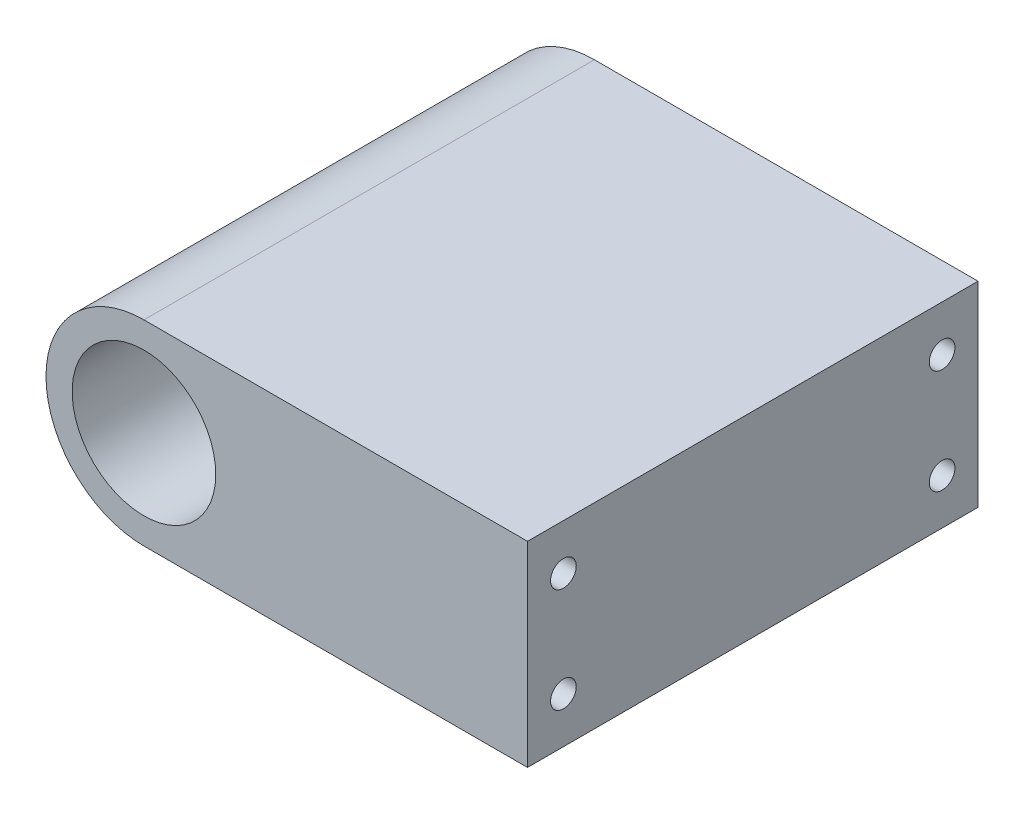
ISO-10303-21;
HEADER;
FILE_DESCRIPTION(('STEP AP214'),'2;1');
FILE_NAME('part.step','',(''),(''),'','','');
FILE_SCHEMA(('AUTOMOTIVE_DESIGN { 1 0 10303 214 1 1 1 1 }'));
ENDSEC;
DATA;
#1=APPLICATION_CONTEXT('core data for automotive mechanical design processes');
#2=APPLICATION_PROTOCOL_DEFINITION('international standard','automotive_design',2000,#1);
#3=PRODUCT_CONTEXT('',#1,'mechanical');
#4=PRODUCT('Part','Part','',(#3));
#5=PRODUCT_RELATED_PRODUCT_CATEGORY('part','',(#4));
#6=PRODUCT_DEFINITION_FORMATION('','',#4);
#7=PRODUCT_DEFINITION_CONTEXT('part definition',#1,'design');
#8=PRODUCT_DEFINITION('design','',#6,#7);
#9=PRODUCT_DEFINITION_SHAPE('','',#8);
#10=(LENGTH_UNIT() NAMED_UNIT(*) SI_UNIT(.MILLI.,.METRE.));
#11=(NAMED_UNIT(*) PLANE_ANGLE_UNIT() SI_UNIT($,.RADIAN.));
#12=(NAMED_UNIT(*) SI_UNIT($,.STERADIAN.) SOLID_ANGLE_UNIT());
#13=UNCERTAINTY_MEASURE_WITH_UNIT(LENGTH_MEASURE(1.E-05),#10,'distance_accuracy_value','');
#14=(GEOMETRIC_REPRESENTATION_CONTEXT(3) GLOBAL_UNCERTAINTY_ASSIGNED_CONTEXT((#13)) GLOBAL_UNIT_ASSIGNED_CONTEXT((#10,
#11,#12)) REPRESENTATION_CONTEXT('',''));
#15=CARTESIAN_POINT('',(0.,0.,0.));
#16=DIRECTION('',(0.,0.,1.));
#17=DIRECTION('',(1.,0.,0.));
#18=AXIS2_PLACEMENT_3D('',#15,#16,#17);
#19=CARTESIAN_POINT('',(0.,0.,87.63));
#20=DIRECTION('',(0.,0.,1.));
#21=DIRECTION('',(1.,0.,0.));
#22=AXIS2_PLACEMENT_3D('',#19,#20,#21);
#23=PLANE('',#22);
#24=CARTESIAN_POINT('',(0.,0.,87.63));
#25=DIRECTION('',(0.,0.,1.));
#26=DIRECTION('',(1.,0.,0.));
#27=AXIS2_PLACEMENT_3D('',#24,#25,#26);
#28=CIRCLE('',#27,19.05);
#29=CARTESIAN_POINT('',(0.,19.05,87.63));
#30=VERTEX_POINT('',#29);
#31=CARTESIAN_POINT('',(0.,-19.05,87.63));
#32=VERTEX_POINT('',#31);
#33=EDGE_CURVE('E138',#30,#32,#28,.T.);
#34=ORIENTED_EDGE('',*,*,#33,.T.);
#35=DIRECTION('',(1.,0.,0.));
#36=VECTOR('',#35,1.);
#37=CARTESIAN_POINT('',(74.609999878,-19.05,87.63));
#38=LINE('',#37,#36);
#39=CARTESIAN_POINT('',(74.609999878,-19.05,87.63));
#40=VERTEX_POINT('',#39);
#41=EDGE_CURVE('E88',#32,#40,#38,.T.);
#42=ORIENTED_EDGE('',*,*,#41,.T.);
#43=DIRECTION('',(0.,1.,0.));
#44=VECTOR('',#43,1.);
#45=CARTESIAN_POINT('',(74.609999878,19.05,87.63));
#46=LINE('',#45,#44);
#47=CARTESIAN_POINT('',(74.609999878,19.05,87.63));
#48=VERTEX_POINT('',#47);
#49=EDGE_CURVE('E141',#40,#48,#46,.T.);
#50=ORIENTED_EDGE('',*,*,#49,.T.);
#51=DIRECTION('',(-1.,0.,0.));
#52=VECTOR('',#51,1.);
#53=CARTESIAN_POINT('',(0.,19.05,87.63));
#54=LINE('',#53,#52);
#55=EDGE_CURVE('E56',#48,#30,#54,.T.);
#56=ORIENTED_EDGE('',*,*,#55,.T.);
#57=EDGE_LOOP('',(#34,#42,#50,#56));
#58=FACE_BOUND('',#57,.T.);
#59=CARTESIAN_POINT('',(0.,0.,87.63));
#60=DIRECTION('',(0.,0.,1.));
#61=DIRECTION('',(1.,0.,0.));
#62=AXIS2_PLACEMENT_3D('',#59,#60,#61);
#63=CIRCLE('',#62,13.97);
#64=CARTESIAN_POINT('',(13.97,0.,87.63));
#65=VERTEX_POINT('',#64);
#66=EDGE_CURVE('E134',#65,#65,#63,.T.);
#67=ORIENTED_EDGE('',*,*,#66,.F.);
#68=EDGE_LOOP('',(#67));
#69=FACE_BOUND('',#68,.T.);
#70=ADVANCED_FACE('F39',(#58,#69),#23,.T.);
#71=CARTESIAN_POINT('',(0.,0.,0.));
#72=DIRECTION('',(0.,0.,1.));
#73=DIRECTION('',(1.,0.,0.));
#74=AXIS2_PLACEMENT_3D('',#71,#72,#73);
#75=PLANE('',#74);
#76=CARTESIAN_POINT('',(0.,0.,0.));
#77=DIRECTION('',(0.,0.,1.));
#78=DIRECTION('',(1.,0.,0.));
#79=AXIS2_PLACEMENT_3D('',#76,#77,#78);
#80=CIRCLE('',#79,16.764);
#81=CARTESIAN_POINT('',(16.764,0.,0.));
#82=VERTEX_POINT('',#81);
#83=EDGE_CURVE('E48',#82,#82,#80,.T.);
#84=ORIENTED_EDGE('',*,*,#83,.T.);
#85=EDGE_LOOP('',(#84));
#86=FACE_BOUND('',#85,.T.);
#87=CARTESIAN_POINT('',(0.,0.,0.));
#88=DIRECTION('',(0.,0.,1.));
#89=DIRECTION('',(1.,0.,0.));
#90=AXIS2_PLACEMENT_3D('',#87,#88,#89);
#91=CIRCLE('',#90,19.05);
#92=CARTESIAN_POINT('',(0.,19.05,0.));
#93=VERTEX_POINT('',#92);
#94=CARTESIAN_POINT('',(0.,-19.05,0.));
#95=VERTEX_POINT('',#94);
#96=EDGE_CURVE('E137',#93,#95,#91,.T.);
#97=ORIENTED_EDGE('',*,*,#96,.F.);
#98=DIRECTION('',(-1.,0.,0.));
#99=VECTOR('',#98,1.);
#100=CARTESIAN_POINT('',(0.,19.05,0.));
#101=LINE('',#100,#99);
#102=CARTESIAN_POINT('',(74.609999878,19.05,0.));
#103=VERTEX_POINT('',#102);
#104=EDGE_CURVE('E80',#103,#93,#101,.T.);
#105=ORIENTED_EDGE('',*,*,#104,.F.);
#106=DIRECTION('',(0.,1.,0.));
#107=VECTOR('',#106,1.);
#108=CARTESIAN_POINT('',(74.609999878,19.05,0.));
#109=LINE('',#108,#107);
#110=CARTESIAN_POINT('',(74.609999878,-19.05,0.));
#111=VERTEX_POINT('',#110);
#112=EDGE_CURVE('E74',#111,#103,#109,.T.);
#113=ORIENTED_EDGE('',*,*,#112,.F.);
#114=DIRECTION('',(1.,0.,0.));
#115=VECTOR('',#114,1.);
#116=CARTESIAN_POINT('',(74.609999878,-19.05,0.));
#117=LINE('',#116,#115);
#118=EDGE_CURVE('E147',#95,#111,#117,.T.);
#119=ORIENTED_EDGE('',*,*,#118,.F.);
#120=EDGE_LOOP('',(#97,#105,#113,#119));
#121=FACE_BOUND('',#120,.T.);
#122=ADVANCED_FACE('F160',(#86,#121),#75,.F.);
#123=CARTESIAN_POINT('',(0.,0.,87.63));
#124=DIRECTION('',(0.,0.,-1.));
#125=DIRECTION('',(-1.,0.,0.));
#126=AXIS2_PLACEMENT_3D('',#123,#124,#125);
#127=CYLINDRICAL_SURFACE('',#126,19.05);
#128=ORIENTED_EDGE('',*,*,#96,.T.);
#129=DIRECTION('',(0.,0.,-1.));
#130=VECTOR('',#129,1.);
#131=CARTESIAN_POINT('',(0.,-19.05,87.63));
#132=LINE('',#131,#130);
#133=EDGE_CURVE('E156',#32,#95,#132,.T.);
#134=ORIENTED_EDGE('',*,*,#133,.F.);
#135=ORIENTED_EDGE('',*,*,#33,.F.);
#136=DIRECTION('',(0.,0.,-1.));
#137=VECTOR('',#136,1.);
#138=CARTESIAN_POINT('',(0.,19.05,87.63));
#139=LINE('',#138,#137);
#140=EDGE_CURVE('E144',#30,#93,#139,.T.);
#141=ORIENTED_EDGE('',*,*,#140,.T.);
#142=EDGE_LOOP('',(#128,#134,#135,#141));
#143=FACE_BOUND('',#142,.T.);
#144=ADVANCED_FACE('F185',(#143),#127,.T.);
#145=CARTESIAN_POINT('',(74.609999878,-19.05,87.63));
#146=DIRECTION('',(0.,1.,0.));
#147=DIRECTION('',(-1.,0.,0.));
#148=AXIS2_PLACEMENT_3D('',#145,#146,#147);
#149=PLANE('',#148);
#150=ORIENTED_EDGE('',*,*,#118,.T.);
#151=DIRECTION('',(0.,0.,-1.));
#152=VECTOR('',#151,1.);
#153=CARTESIAN_POINT('',(74.609999878,-19.05,87.63));
#154=LINE('',#153,#152);
#155=EDGE_CURVE('E154',#40,#111,#154,.T.);
#156=ORIENTED_EDGE('',*,*,#155,.F.);
#157=ORIENTED_EDGE('',*,*,#41,.F.);
#158=ORIENTED_EDGE('',*,*,#133,.T.);
#159=EDGE_LOOP('',(#150,#156,#157,#158));
#160=FACE_BOUND('',#159,.T.);
#161=ADVANCED_FACE('F193',(#160),#149,.F.);
#162=CARTESIAN_POINT('',(74.609999878,19.05,87.63));
#163=DIRECTION('',(-1.,0.,0.));
#164=DIRECTION('',(0.,0.,1.));
#165=AXIS2_PLACEMENT_3D('',#162,#163,#164);
#166=PLANE('',#165);
#167=CARTESIAN_POINT('',(74.609999878,10.16,6.985));
#168=DIRECTION('',(1.,0.,0.));
#169=DIRECTION('',(0.,0.,-1.));
#170=AXIS2_PLACEMENT_3D('',#167,#168,#169);
#171=CIRCLE('',#170,2.5);
#172=CARTESIAN_POINT('',(74.609999878,10.16,4.48500000000001));
#173=VERTEX_POINT('',#172);
#174=EDGE_CURVE('E112',#173,#173,#171,.T.);
#175=ORIENTED_EDGE('',*,*,#174,.F.);
#176=EDGE_LOOP('',(#175));
#177=FACE_BOUND('',#176,.T.);
#178=CARTESIAN_POINT('',(74.609999878,-10.16,6.985));
#179=DIRECTION('',(1.,0.,0.));
#180=DIRECTION('',(0.,0.,-1.));
#181=AXIS2_PLACEMENT_3D('',#178,#179,#180);
#182=CIRCLE('',#181,2.5);
#183=CARTESIAN_POINT('',(74.609999878,-10.16,4.48500000000001));
#184=VERTEX_POINT('',#183);
#185=EDGE_CURVE('E111',#184,#184,#182,.T.);
#186=ORIENTED_EDGE('',*,*,#185,.F.);
#187=EDGE_LOOP('',(#186));
#188=FACE_BOUND('',#187,.T.);
#189=CARTESIAN_POINT('',(74.609999878,10.16,80.645));
#190=DIRECTION('',(1.,0.,0.));
#191=DIRECTION('',(0.,0.,-1.));
#192=AXIS2_PLACEMENT_3D('',#189,#190,#191);
#193=CIRCLE('',#192,2.5);
#194=CARTESIAN_POINT('',(74.609999878,10.16,78.145));
#195=VERTEX_POINT('',#194);
#196=EDGE_CURVE('E122',#195,#195,#193,.T.);
#197=ORIENTED_EDGE('',*,*,#196,.F.);
#198=EDGE_LOOP('',(#197));
#199=FACE_BOUND('',#198,.T.);
#200=CARTESIAN_POINT('',(74.609999878,-10.16,80.645));
#201=DIRECTION('',(1.,0.,0.));
#202=DIRECTION('',(0.,0.,-1.));
#203=AXIS2_PLACEMENT_3D('',#200,#201,#202);
#204=CIRCLE('',#203,2.5);
#205=CARTESIAN_POINT('',(74.609999878,-10.16,78.145));
#206=VERTEX_POINT('',#205);
#207=EDGE_CURVE('E128',#206,#206,#204,.T.);
#208=ORIENTED_EDGE('',*,*,#207,.F.);
#209=EDGE_LOOP('',(#208));
#210=FACE_BOUND('',#209,.T.);
#211=ORIENTED_EDGE('',*,*,#112,.T.);
#212=DIRECTION('',(0.,0.,-1.));
#213=VECTOR('',#212,1.);
#214=CARTESIAN_POINT('',(74.609999878,19.05,87.63));
#215=LINE('',#214,#213);
#216=EDGE_CURVE('E152',#48,#103,#215,.T.);
#217=ORIENTED_EDGE('',*,*,#216,.F.);
#218=ORIENTED_EDGE('',*,*,#49,.F.);
#219=ORIENTED_EDGE('',*,*,#155,.T.);
#220=EDGE_LOOP('',(#211,#217,#218,#219));
#221=FACE_BOUND('',#220,.T.);
#222=ADVANCED_FACE('F191',(#177,#188,#199,#210,#221),#166,.F.);
#223=CARTESIAN_POINT('',(0.,19.05,87.63));
#224=DIRECTION('',(0.,-1.,0.));
#225=DIRECTION('',(1.,0.,0.));
#226=AXIS2_PLACEMENT_3D('',#223,#224,#225);
#227=PLANE('',#226);
#228=ORIENTED_EDGE('',*,*,#104,.T.);
#229=ORIENTED_EDGE('',*,*,#140,.F.);
#230=ORIENTED_EDGE('',*,*,#55,.F.);
#231=ORIENTED_EDGE('',*,*,#216,.T.);
#232=EDGE_LOOP('',(#228,#229,#230,#231));
#233=FACE_BOUND('',#232,.T.);
#234=ADVANCED_FACE('F175',(#233),#227,.F.);
#235=CARTESIAN_POINT('',(0.,0.,87.63));
#236=DIRECTION('',(0.,0.,-1.));
#237=DIRECTION('',(-1.,0.,0.));
#238=AXIS2_PLACEMENT_3D('',#235,#236,#237);
#239=CYLINDRICAL_SURFACE('',#238,13.97);
#240=CARTESIAN_POINT('',(0.,0.,2.794));
#241=DIRECTION('',(0.,0.,1.));
#242=DIRECTION('',(1.,0.,0.));
#243=AXIS2_PLACEMENT_3D('',#240,#241,#242);
#244=CIRCLE('',#243,13.97);
#245=CARTESIAN_POINT('',(13.97,0.,2.794));
#246=VERTEX_POINT('',#245);
#247=EDGE_CURVE('E11',#246,#246,#244,.F.);
#248=ORIENTED_EDGE('',*,*,#247,.T.);
#249=EDGE_LOOP('',(#248));
#250=FACE_BOUND('',#249,.T.);
#251=ORIENTED_EDGE('',*,*,#66,.T.);
#252=EDGE_LOOP('',(#251));
#253=FACE_BOUND('',#252,.T.);
#254=ADVANCED_FACE('F165',(#250,#253),#239,.F.);
#255=CARTESIAN_POINT('',(0.,0.,2.794));
#256=DIRECTION('',(0.,0.,1.));
#257=DIRECTION('',(1.,0.,0.));
#258=AXIS2_PLACEMENT_3D('',#255,#256,#257);
#259=TOROIDAL_SURFACE('',#258,16.764,2.794);
#260=ORIENTED_EDGE('',*,*,#247,.F.);
#261=EDGE_LOOP('',(#260));
#262=FACE_BOUND('',#261,.T.);
#263=ORIENTED_EDGE('',*,*,#83,.F.);
#264=EDGE_LOOP('',(#263));
#265=FACE_BOUND('',#264,.T.);
#266=ADVANCED_FACE('F41',(#262,#265),#259,.T.);
#267=CARTESIAN_POINT('',(33.461999878,-10.16,80.645));
#268=DIRECTION('',(1.,0.,0.));
#269=DIRECTION('',(0.,0.,-1.));
#270=AXIS2_PLACEMENT_3D('',#267,#268,#269);
#271=CONICAL_SURFACE('',#270,2.49999999999999,1.02974425867665);
#272=CARTESIAN_POINT('',(31.9598483304311,-10.16,80.645));
#273=VERTEX_POINT('',#272);
#274=VERTEX_LOOP('',#273);
#275=FACE_BOUND('',#274,.T.);
#276=CARTESIAN_POINT('',(33.461999878,-10.16,80.645));
#277=DIRECTION('',(1.,0.,0.));
#278=DIRECTION('',(0.,0.,-1.));
#279=AXIS2_PLACEMENT_3D('',#276,#277,#278);
#280=CIRCLE('',#279,2.49999999999999);
#281=CARTESIAN_POINT('',(33.461999878,-10.16,78.145));
#282=VERTEX_POINT('',#281);
#283=EDGE_CURVE('E131',#282,#282,#280,.T.);
#284=ORIENTED_EDGE('',*,*,#283,.T.);
#285=EDGE_LOOP('',(#284));
#286=FACE_BOUND('',#285,.T.);
#287=ADVANCED_FACE('F164',(#275,#286),#271,.F.);
#288=CARTESIAN_POINT('',(74.609999878,-10.16,80.645));
#289=DIRECTION('',(1.,0.,0.));
#290=DIRECTION('',(0.,0.,-1.));
#291=AXIS2_PLACEMENT_3D('',#288,#289,#290);
#292=CYLINDRICAL_SURFACE('',#291,2.49999999999999);
#293=ORIENTED_EDGE('',*,*,#283,.F.);
#294=EDGE_LOOP('',(#293));
#295=FACE_BOUND('',#294,.T.);
#296=ORIENTED_EDGE('',*,*,#207,.T.);
#297=EDGE_LOOP('',(#296));
#298=FACE_BOUND('',#297,.T.);
#299=ADVANCED_FACE('F172',(#295,#298),#292,.F.);
#300=CARTESIAN_POINT('',(33.461999878,10.16,80.645));
#301=DIRECTION('',(1.,0.,0.));
#302=DIRECTION('',(0.,0.,-1.));
#303=AXIS2_PLACEMENT_3D('',#300,#301,#302);
#304=CONICAL_SURFACE('',#303,2.49999999999999,1.02974425867665);
#305=CARTESIAN_POINT('',(31.9598483304311,10.16,80.645));
#306=VERTEX_POINT('',#305);
#307=VERTEX_LOOP('',#306);
#308=FACE_BOUND('',#307,.T.);
#309=CARTESIAN_POINT('',(33.461999878,10.16,80.645));
#310=DIRECTION('',(1.,0.,0.));
#311=DIRECTION('',(0.,0.,-1.));
#312=AXIS2_PLACEMENT_3D('',#309,#310,#311);
#313=CIRCLE('',#312,2.49999999999999);
#314=CARTESIAN_POINT('',(33.461999878,10.16,78.145));
#315=VERTEX_POINT('',#314);
#316=EDGE_CURVE('E125',#315,#315,#313,.T.);
#317=ORIENTED_EDGE('',*,*,#316,.T.);
#318=EDGE_LOOP('',(#317));
#319=FACE_BOUND('',#318,.T.);
#320=ADVANCED_FACE('F244',(#308,#319),#304,.F.);
#321=CARTESIAN_POINT('',(74.609999878,10.16,80.645));
#322=DIRECTION('',(1.,0.,0.));
#323=DIRECTION('',(0.,0.,-1.));
#324=AXIS2_PLACEMENT_3D('',#321,#322,#323);
#325=CYLINDRICAL_SURFACE('',#324,2.49999999999999);
#326=ORIENTED_EDGE('',*,*,#316,.F.);
#327=EDGE_LOOP('',(#326));
#328=FACE_BOUND('',#327,.T.);
#329=ORIENTED_EDGE('',*,*,#196,.T.);
#330=EDGE_LOOP('',(#329));
#331=FACE_BOUND('',#330,.T.);
#332=ADVANCED_FACE('F254',(#328,#331),#325,.F.);
#333=CARTESIAN_POINT('',(33.461999878,-10.16,6.985));
#334=DIRECTION('',(1.,0.,0.));
#335=DIRECTION('',(0.,0.,-1.));
#336=AXIS2_PLACEMENT_3D('',#333,#334,#335);
#337=CONICAL_SURFACE('',#336,2.49999999999999,1.02974425867665);
#338=CARTESIAN_POINT('',(31.9598483304311,-10.16,6.985));
#339=VERTEX_POINT('',#338);
#340=VERTEX_LOOP('',#339);
#341=FACE_BOUND('',#340,.T.);
#342=CARTESIAN_POINT('',(33.461999878,-10.16,6.985));
#343=DIRECTION('',(1.,0.,0.));
#344=DIRECTION('',(0.,0.,-1.));
#345=AXIS2_PLACEMENT_3D('',#342,#343,#344);
#346=CIRCLE('',#345,2.49999999999999);
#347=CARTESIAN_POINT('',(33.461999878,-10.16,4.48500000000001));
#348=VERTEX_POINT('',#347);
#349=EDGE_CURVE('E115',#348,#348,#346,.T.);
#350=ORIENTED_EDGE('',*,*,#349,.T.);
#351=EDGE_LOOP('',(#350));
#352=FACE_BOUND('',#351,.T.);
#353=ADVANCED_FACE('F264',(#341,#352),#337,.F.);
#354=CARTESIAN_POINT('',(74.609999878,-10.16,6.985));
#355=DIRECTION('',(1.,0.,0.));
#356=DIRECTION('',(0.,0.,-1.));
#357=AXIS2_PLACEMENT_3D('',#354,#355,#356);
#358=CYLINDRICAL_SURFACE('',#357,2.49999999999999);
#359=ORIENTED_EDGE('',*,*,#349,.F.);
#360=EDGE_LOOP('',(#359));
#361=FACE_BOUND('',#360,.T.);
#362=ORIENTED_EDGE('',*,*,#185,.T.);
#363=EDGE_LOOP('',(#362));
#364=FACE_BOUND('',#363,.T.);
#365=ADVANCED_FACE('F105',(#361,#364),#358,.F.);
#366=CARTESIAN_POINT('',(33.461999878,10.16,6.985));
#367=DIRECTION('',(1.,0.,0.));
#368=DIRECTION('',(0.,0.,-1.));
#369=AXIS2_PLACEMENT_3D('',#366,#367,#368);
#370=CONICAL_SURFACE('',#369,2.49999999999999,1.02974425867665);
#371=CARTESIAN_POINT('',(31.9598483304311,10.16,6.985));
#372=VERTEX_POINT('',#371);
#373=VERTEX_LOOP('',#372);
#374=FACE_BOUND('',#373,.T.);
#375=CARTESIAN_POINT('',(33.461999878,10.16,6.985));
#376=DIRECTION('',(1.,0.,0.));
#377=DIRECTION('',(0.,0.,-1.));
#378=AXIS2_PLACEMENT_3D('',#375,#376,#377);
#379=CIRCLE('',#378,2.49999999999999);
#380=CARTESIAN_POINT('',(33.461999878,10.16,4.48500000000001));
#381=VERTEX_POINT('',#380);
#382=EDGE_CURVE('E109',#381,#381,#379,.T.);
#383=ORIENTED_EDGE('',*,*,#382,.T.);
#384=EDGE_LOOP('',(#383));
#385=FACE_BOUND('',#384,.T.);
#386=ADVANCED_FACE('F101',(#374,#385),#370,.F.);
#387=CARTESIAN_POINT('',(74.609999878,10.16,6.985));
#388=DIRECTION('',(1.,0.,0.));
#389=DIRECTION('',(0.,0.,-1.));
#390=AXIS2_PLACEMENT_3D('',#387,#388,#389);
#391=CYLINDRICAL_SURFACE('',#390,2.49999999999999);
#392=ORIENTED_EDGE('',*,*,#382,.F.);
#393=EDGE_LOOP('',(#392));
#394=FACE_BOUND('',#393,.T.);
#395=ORIENTED_EDGE('',*,*,#174,.T.);
#396=EDGE_LOOP('',(#395));
#397=FACE_BOUND('',#396,.T.);
#398=ADVANCED_FACE('F104',(#394,#397),#391,.F.);
#399=CLOSED_SHELL('',(#70,#122,#144,#161,#222,#234,#254,#266,#287,#299,#320,#332,#353,#365,#386,#398));
#400=MANIFOLD_SOLID_BREP('B2',#399);
#401=ADVANCED_BREP_SHAPE_REPRESENTATION('',(#18,#400),#14);
#402=SHAPE_DEFINITION_REPRESENTATION(#9,#401);
ENDSEC;
END-ISO-10303-21;
